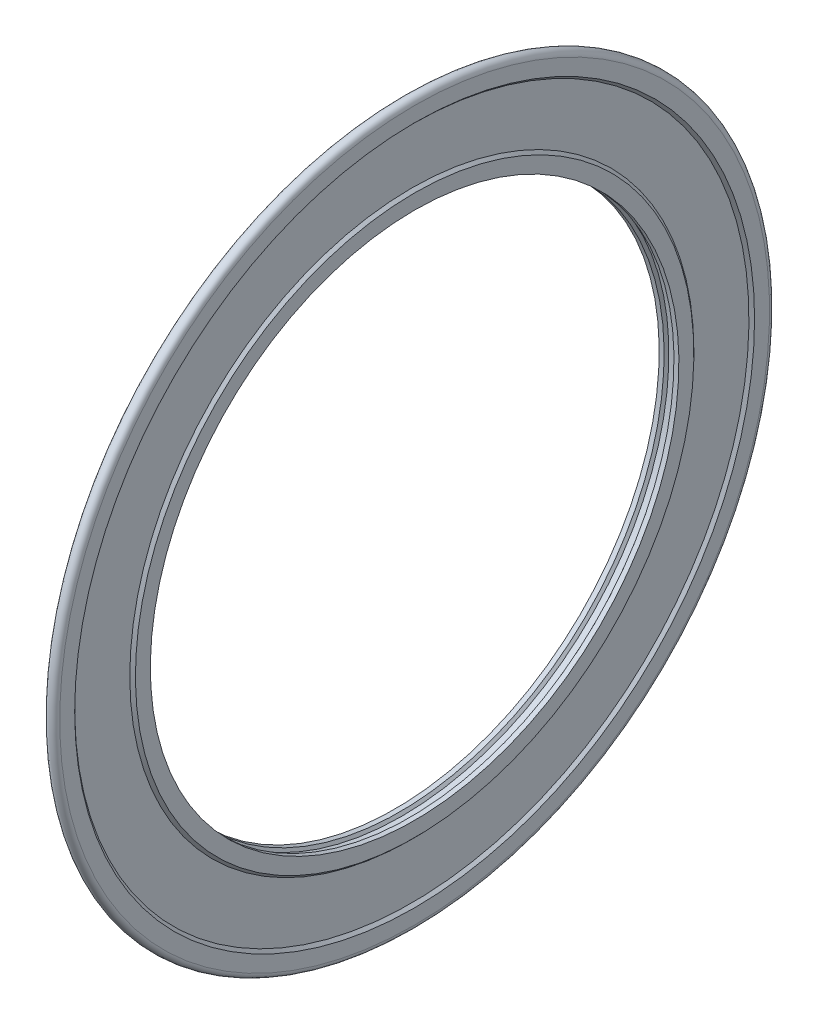
ISO-10303-21;
HEADER;
FILE_DESCRIPTION(('STEP AP214'),'2;1');
FILE_NAME('part.step','',(''),(''),'','','');
FILE_SCHEMA(('AUTOMOTIVE_DESIGN { 1 0 10303 214 1 1 1 1 }'));
ENDSEC;
DATA;
#1=APPLICATION_CONTEXT('core data for automotive mechanical design processes');
#2=APPLICATION_PROTOCOL_DEFINITION('international standard','automotive_design',2000,#1);
#3=PRODUCT_CONTEXT('',#1,'mechanical');
#4=PRODUCT('Part','Part','',(#3));
#5=PRODUCT_RELATED_PRODUCT_CATEGORY('part','',(#4));
#6=PRODUCT_DEFINITION_FORMATION('','',#4);
#7=PRODUCT_DEFINITION_CONTEXT('part definition',#1,'design');
#8=PRODUCT_DEFINITION('design','',#6,#7);
#9=PRODUCT_DEFINITION_SHAPE('','',#8);
#10=(LENGTH_UNIT() NAMED_UNIT(*) SI_UNIT(.MILLI.,.METRE.));
#11=(NAMED_UNIT(*) PLANE_ANGLE_UNIT() SI_UNIT($,.RADIAN.));
#12=(NAMED_UNIT(*) SI_UNIT($,.STERADIAN.) SOLID_ANGLE_UNIT());
#13=UNCERTAINTY_MEASURE_WITH_UNIT(LENGTH_MEASURE(1.E-05),#10,'distance_accuracy_value','');
#14=(GEOMETRIC_REPRESENTATION_CONTEXT(3) GLOBAL_UNCERTAINTY_ASSIGNED_CONTEXT((#13)) GLOBAL_UNIT_ASSIGNED_CONTEXT((#10,
#11,#12)) REPRESENTATION_CONTEXT('',''));
#15=CARTESIAN_POINT('',(0.,0.,0.));
#16=DIRECTION('',(0.,0.,1.));
#17=DIRECTION('',(1.,0.,0.));
#18=AXIS2_PLACEMENT_3D('',#15,#16,#17);
#19=CARTESIAN_POINT('',(6.835,0.,0.));
#20=DIRECTION('',(1.,0.,0.));
#21=DIRECTION('',(0.,1.,0.));
#22=AXIS2_PLACEMENT_3D('',#19,#20,#21);
#23=CONICAL_SURFACE('',#22,13.22485,0.785398163397438);
#24=CARTESIAN_POINT('',(6.78,0.,0.));
#25=DIRECTION('',(-1.,0.,0.));
#26=DIRECTION('',(0.,1.,0.));
#27=AXIS2_PLACEMENT_3D('',#24,#25,#26);
#28=CIRCLE('',#27,13.16985);
#29=CARTESIAN_POINT('',(6.78,13.16985,0.));
#30=VERTEX_POINT('',#29);
#31=EDGE_CURVE('E11',#30,#30,#28,.T.);
#32=ORIENTED_EDGE('',*,*,#31,.T.);
#33=EDGE_LOOP('',(#32));
#34=FACE_BOUND('',#33,.T.);
#35=CARTESIAN_POINT('',(6.89,0.,0.));
#36=DIRECTION('',(-1.,0.,0.));
#37=DIRECTION('',(0.,1.,0.));
#38=AXIS2_PLACEMENT_3D('',#35,#36,#37);
#39=CIRCLE('',#38,13.27985);
#40=CARTESIAN_POINT('',(6.89,13.27985,0.));
#41=VERTEX_POINT('',#40);
#42=EDGE_CURVE('E92',#41,#41,#39,.T.);
#43=ORIENTED_EDGE('',*,*,#42,.F.);
#44=EDGE_LOOP('',(#43));
#45=FACE_BOUND('',#44,.T.);
#46=ADVANCED_FACE('F16',(#34,#45),#23,.F.);
#47=CARTESIAN_POINT('',(6.78,12.0936,0.));
#48=DIRECTION('',(1.,0.,0.));
#49=DIRECTION('',(0.,-1.,0.));
#50=AXIS2_PLACEMENT_3D('',#47,#48,#49);
#51=PLANE('',#50);
#52=CARTESIAN_POINT('',(6.78,0.,0.));
#53=DIRECTION('',(-1.,0.,0.));
#54=DIRECTION('',(0.,1.,0.));
#55=AXIS2_PLACEMENT_3D('',#52,#53,#54);
#56=CIRCLE('',#55,11.01735);
#57=CARTESIAN_POINT('',(6.78,11.01735,0.));
#58=VERTEX_POINT('',#57);
#59=EDGE_CURVE('E25',#58,#58,#56,.T.);
#60=ORIENTED_EDGE('',*,*,#59,.T.);
#61=EDGE_LOOP('',(#60));
#62=FACE_BOUND('',#61,.T.);
#63=ORIENTED_EDGE('',*,*,#31,.F.);
#64=EDGE_LOOP('',(#63));
#65=FACE_BOUND('',#64,.T.);
#66=ADVANCED_FACE('F121',(#62,#65),#51,.T.);
#67=CARTESIAN_POINT('',(6.835,0.,0.));
#68=DIRECTION('',(-1.,0.,0.));
#69=DIRECTION('',(0.,1.,0.));
#70=AXIS2_PLACEMENT_3D('',#67,#68,#69);
#71=CONICAL_SURFACE('',#70,10.96235,0.785398163397446);
#72=CARTESIAN_POINT('',(6.89,0.,0.));
#73=DIRECTION('',(-1.,0.,0.));
#74=DIRECTION('',(0.,1.,0.));
#75=AXIS2_PLACEMENT_3D('',#72,#73,#74);
#76=CIRCLE('',#75,10.90735);
#77=CARTESIAN_POINT('',(6.89,10.90735,0.));
#78=VERTEX_POINT('',#77);
#79=EDGE_CURVE('E84',#78,#78,#76,.T.);
#80=ORIENTED_EDGE('',*,*,#79,.T.);
#81=EDGE_LOOP('',(#80));
#82=FACE_BOUND('',#81,.T.);
#83=ORIENTED_EDGE('',*,*,#59,.F.);
#84=EDGE_LOOP('',(#83));
#85=FACE_BOUND('',#84,.T.);
#86=ADVANCED_FACE('F117',(#82,#85),#71,.T.);
#87=CARTESIAN_POINT('',(6.89,10.615675,0.));
#88=DIRECTION('',(1.,0.,0.));
#89=DIRECTION('',(0.,-1.,0.));
#90=AXIS2_PLACEMENT_3D('',#87,#88,#89);
#91=PLANE('',#90);
#92=CARTESIAN_POINT('',(6.89,0.,0.));
#93=DIRECTION('',(-1.,0.,0.));
#94=DIRECTION('',(0.,1.,0.));
#95=AXIS2_PLACEMENT_3D('',#92,#93,#94);
#96=CIRCLE('',#95,10.324);
#97=CARTESIAN_POINT('',(6.89,10.324,0.));
#98=VERTEX_POINT('',#97);
#99=EDGE_CURVE('E74',#98,#98,#96,.T.);
#100=ORIENTED_EDGE('',*,*,#99,.T.);
#101=EDGE_LOOP('',(#100));
#102=FACE_BOUND('',#101,.T.);
#103=ORIENTED_EDGE('',*,*,#79,.F.);
#104=EDGE_LOOP('',(#103));
#105=FACE_BOUND('',#104,.T.);
#106=ADVANCED_FACE('F103',(#102,#105),#91,.T.);
#107=CARTESIAN_POINT('',(6.79375,0.,0.));
#108=DIRECTION('',(1.,0.,0.));
#109=DIRECTION('',(0.,1.,0.));
#110=AXIS2_PLACEMENT_3D('',#107,#108,#109);
#111=CYLINDRICAL_SURFACE('',#110,10.324);
#112=CARTESIAN_POINT('',(6.6975,0.,0.));
#113=DIRECTION('',(-1.,0.,0.));
#114=DIRECTION('',(0.,1.,0.));
#115=AXIS2_PLACEMENT_3D('',#112,#113,#114);
#116=CIRCLE('',#115,10.324);
#117=CARTESIAN_POINT('',(6.6975,10.324,0.));
#118=VERTEX_POINT('',#117);
#119=EDGE_CURVE('E72',#118,#118,#116,.T.);
#120=ORIENTED_EDGE('',*,*,#119,.T.);
#121=EDGE_LOOP('',(#120));
#122=FACE_BOUND('',#121,.T.);
#123=ORIENTED_EDGE('',*,*,#99,.F.);
#124=EDGE_LOOP('',(#123));
#125=FACE_BOUND('',#124,.T.);
#126=ADVANCED_FACE('F106',(#122,#125),#111,.F.);
#127=CARTESIAN_POINT('',(6.65898858539847,0.,0.));
#128=DIRECTION('',(-1.,0.,0.));
#129=DIRECTION('',(0.,1.,0.));
#130=AXIS2_PLACEMENT_3D('',#127,#128,#129);
#131=CONICAL_SURFACE('',#130,10.379,0.959931088596881);
#132=CARTESIAN_POINT('',(6.62047717079693,0.,0.));
#133=DIRECTION('',(-1.,0.,0.));
#134=DIRECTION('',(0.,1.,0.));
#135=AXIS2_PLACEMENT_3D('',#132,#133,#134);
#136=CIRCLE('',#135,10.434);
#137=CARTESIAN_POINT('',(6.62047717079693,10.434,0.));
#138=VERTEX_POINT('',#137);
#139=EDGE_CURVE('E20',#138,#138,#136,.T.);
#140=ORIENTED_EDGE('',*,*,#139,.T.);
#141=EDGE_LOOP('',(#140));
#142=FACE_BOUND('',#141,.T.);
#143=ORIENTED_EDGE('',*,*,#119,.F.);
#144=EDGE_LOOP('',(#143));
#145=FACE_BOUND('',#144,.T.);
#146=ADVANCED_FACE('F69',(#142,#145),#131,.F.);
#147=CARTESIAN_POINT('',(6.505,0.,0.));
#148=DIRECTION('',(1.,0.,0.));
#149=DIRECTION('',(0.,1.,0.));
#150=AXIS2_PLACEMENT_3D('',#147,#148,#149);
#151=CYLINDRICAL_SURFACE('',#150,10.434);
#152=CARTESIAN_POINT('',(6.38952282920307,0.,0.));
#153=DIRECTION('',(-1.,0.,0.));
#154=DIRECTION('',(0.,1.,0.));
#155=AXIS2_PLACEMENT_3D('',#152,#153,#154);
#156=CIRCLE('',#155,10.434);
#157=CARTESIAN_POINT('',(6.38952282920307,10.434,0.));
#158=VERTEX_POINT('',#157);
#159=EDGE_CURVE('E73',#158,#158,#156,.T.);
#160=ORIENTED_EDGE('',*,*,#159,.T.);
#161=EDGE_LOOP('',(#160));
#162=FACE_BOUND('',#161,.T.);
#163=ORIENTED_EDGE('',*,*,#139,.F.);
#164=EDGE_LOOP('',(#163));
#165=FACE_BOUND('',#164,.T.);
#166=ADVANCED_FACE('F115',(#162,#165),#151,.F.);
#167=CARTESIAN_POINT('',(6.35101141460154,0.,0.));
#168=DIRECTION('',(1.,0.,0.));
#169=DIRECTION('',(0.,1.,0.));
#170=AXIS2_PLACEMENT_3D('',#167,#168,#169);
#171=CONICAL_SURFACE('',#170,10.379,0.959931088596873);
#172=CARTESIAN_POINT('',(6.3125,0.,0.));
#173=DIRECTION('',(-1.,0.,0.));
#174=DIRECTION('',(0.,1.,0.));
#175=AXIS2_PLACEMENT_3D('',#172,#173,#174);
#176=CIRCLE('',#175,10.324);
#177=CARTESIAN_POINT('',(6.3125,10.324,0.));
#178=VERTEX_POINT('',#177);
#179=EDGE_CURVE('E76',#178,#178,#176,.T.);
#180=ORIENTED_EDGE('',*,*,#179,.T.);
#181=EDGE_LOOP('',(#180));
#182=FACE_BOUND('',#181,.T.);
#183=ORIENTED_EDGE('',*,*,#159,.F.);
#184=EDGE_LOOP('',(#183));
#185=FACE_BOUND('',#184,.T.);
#186=ADVANCED_FACE('F130',(#182,#185),#171,.F.);
#187=CARTESIAN_POINT('',(6.21625,0.,0.));
#188=DIRECTION('',(1.,0.,0.));
#189=DIRECTION('',(0.,1.,0.));
#190=AXIS2_PLACEMENT_3D('',#187,#188,#189);
#191=CYLINDRICAL_SURFACE('',#190,10.324);
#192=CARTESIAN_POINT('',(6.12,0.,0.));
#193=DIRECTION('',(-1.,0.,0.));
#194=DIRECTION('',(0.,1.,0.));
#195=AXIS2_PLACEMENT_3D('',#192,#193,#194);
#196=CIRCLE('',#195,10.324);
#197=CARTESIAN_POINT('',(6.12,10.324,0.));
#198=VERTEX_POINT('',#197);
#199=EDGE_CURVE('E80',#198,#198,#196,.T.);
#200=ORIENTED_EDGE('',*,*,#199,.T.);
#201=EDGE_LOOP('',(#200));
#202=FACE_BOUND('',#201,.T.);
#203=ORIENTED_EDGE('',*,*,#179,.F.);
#204=EDGE_LOOP('',(#203));
#205=FACE_BOUND('',#204,.T.);
#206=ADVANCED_FACE('F134',(#202,#205),#191,.F.);
#207=CARTESIAN_POINT('',(6.24375,0.,0.));
#208=DIRECTION('',(1.,0.,0.));
#209=DIRECTION('',(0.,1.,0.));
#210=AXIS2_PLACEMENT_3D('',#207,#208,#209);
#211=CONICAL_SURFACE('',#210,10.6640003306575,1.22173047639603);
#212=CARTESIAN_POINT('',(6.3675,0.,0.));
#213=DIRECTION('',(-1.,0.,0.));
#214=DIRECTION('',(0.,1.,0.));
#215=AXIS2_PLACEMENT_3D('',#212,#213,#214);
#216=CIRCLE('',#215,11.004000661315);
#217=CARTESIAN_POINT('',(6.3675,11.004000661315,0.));
#218=VERTEX_POINT('',#217);
#219=EDGE_CURVE('E86',#218,#218,#216,.T.);
#220=ORIENTED_EDGE('',*,*,#219,.T.);
#221=EDGE_LOOP('',(#220));
#222=FACE_BOUND('',#221,.T.);
#223=ORIENTED_EDGE('',*,*,#199,.F.);
#224=EDGE_LOOP('',(#223));
#225=FACE_BOUND('',#224,.T.);
#226=ADVANCED_FACE('F136',(#222,#225),#211,.T.);
#227=CARTESIAN_POINT('',(6.3675,12.2096087085861,0.));
#228=DIRECTION('',(-1.,0.,0.));
#229=DIRECTION('',(0.,1.,0.));
#230=AXIS2_PLACEMENT_3D('',#227,#228,#229);
#231=PLANE('',#230);
#232=CARTESIAN_POINT('',(6.3675,0.,0.));
#233=DIRECTION('',(-1.,0.,0.));
#234=DIRECTION('',(0.,1.,0.));
#235=AXIS2_PLACEMENT_3D('',#232,#233,#234);
#236=CIRCLE('',#235,13.4152167558572);
#237=CARTESIAN_POINT('',(6.3675,13.4152167558572,0.));
#238=VERTEX_POINT('',#237);
#239=EDGE_CURVE('E85',#238,#238,#236,.T.);
#240=ORIENTED_EDGE('',*,*,#239,.T.);
#241=EDGE_LOOP('',(#240));
#242=FACE_BOUND('',#241,.T.);
#243=ORIENTED_EDGE('',*,*,#219,.F.);
#244=EDGE_LOOP('',(#243));
#245=FACE_BOUND('',#244,.T.);
#246=ADVANCED_FACE('F139',(#242,#245),#231,.T.);
#247=CARTESIAN_POINT('',(6.41042114716866,0.,0.));
#248=DIRECTION('',(1.,0.,0.));
#249=DIRECTION('',(0.,1.,0.));
#250=AXIS2_PLACEMENT_3D('',#247,#248,#249);
#251=CONICAL_SURFACE('',#250,13.658634677472,1.39626340159546);
#252=CARTESIAN_POINT('',(6.45334229433732,0.,0.));
#253=DIRECTION('',(-1.,0.,0.));
#254=DIRECTION('',(0.,1.,0.));
#255=AXIS2_PLACEMENT_3D('',#252,#253,#254);
#256=CIRCLE('',#255,13.9020525990867);
#257=CARTESIAN_POINT('',(6.45334229433732,13.9020525990867,0.));
#258=VERTEX_POINT('',#257);
#259=EDGE_CURVE('E87',#258,#258,#256,.T.);
#260=ORIENTED_EDGE('',*,*,#259,.T.);
#261=EDGE_LOOP('',(#260));
#262=FACE_BOUND('',#261,.T.);
#263=ORIENTED_EDGE('',*,*,#239,.F.);
#264=EDGE_LOOP('',(#263));
#265=FACE_BOUND('',#264,.T.);
#266=ADVANCED_FACE('F18',(#262,#265),#251,.T.);
#267=CARTESIAN_POINT('',(6.67,0.,0.));
#268=DIRECTION('',(-1.,0.,0.));
#269=DIRECTION('',(0.,0.,1.));
#270=AXIS2_PLACEMENT_3D('',#267,#268,#269);
#271=TOROIDAL_SURFACE('',#270,13.86385,0.22);
#272=CARTESIAN_POINT('',(6.89,0.,0.));
#273=DIRECTION('',(-1.,0.,0.));
#274=DIRECTION('',(0.,1.,0.));
#275=AXIS2_PLACEMENT_3D('',#272,#273,#274);
#276=CIRCLE('',#275,13.86385);
#277=CARTESIAN_POINT('',(6.89,13.86385,0.));
#278=VERTEX_POINT('',#277);
#279=EDGE_CURVE('E96',#278,#278,#276,.T.);
#280=ORIENTED_EDGE('',*,*,#279,.T.);
#281=EDGE_LOOP('',(#280));
#282=FACE_BOUND('',#281,.T.);
#283=ORIENTED_EDGE('',*,*,#259,.F.);
#284=EDGE_LOOP('',(#283));
#285=FACE_BOUND('',#284,.T.);
#286=ADVANCED_FACE('F159',(#282,#285),#271,.T.);
#287=CARTESIAN_POINT('',(6.89,13.57185,0.));
#288=DIRECTION('',(1.,0.,0.));
#289=DIRECTION('',(0.,-1.,0.));
#290=AXIS2_PLACEMENT_3D('',#287,#288,#289);
#291=PLANE('',#290);
#292=ORIENTED_EDGE('',*,*,#42,.T.);
#293=EDGE_LOOP('',(#292));
#294=FACE_BOUND('',#293,.T.);
#295=ORIENTED_EDGE('',*,*,#279,.F.);
#296=EDGE_LOOP('',(#295));
#297=FACE_BOUND('',#296,.T.);
#298=ADVANCED_FACE('F162',(#294,#297),#291,.T.);
#299=CLOSED_SHELL('',(#46,#66,#86,#106,#126,#146,#166,#186,#206,#226,#246,#266,#286,#298));
#300=MANIFOLD_SOLID_BREP('B1',#299);
#301=ADVANCED_BREP_SHAPE_REPRESENTATION('',(#18,#300),#14);
#302=SHAPE_DEFINITION_REPRESENTATION(#9,#301);
ENDSEC;
END-ISO-10303-21;
